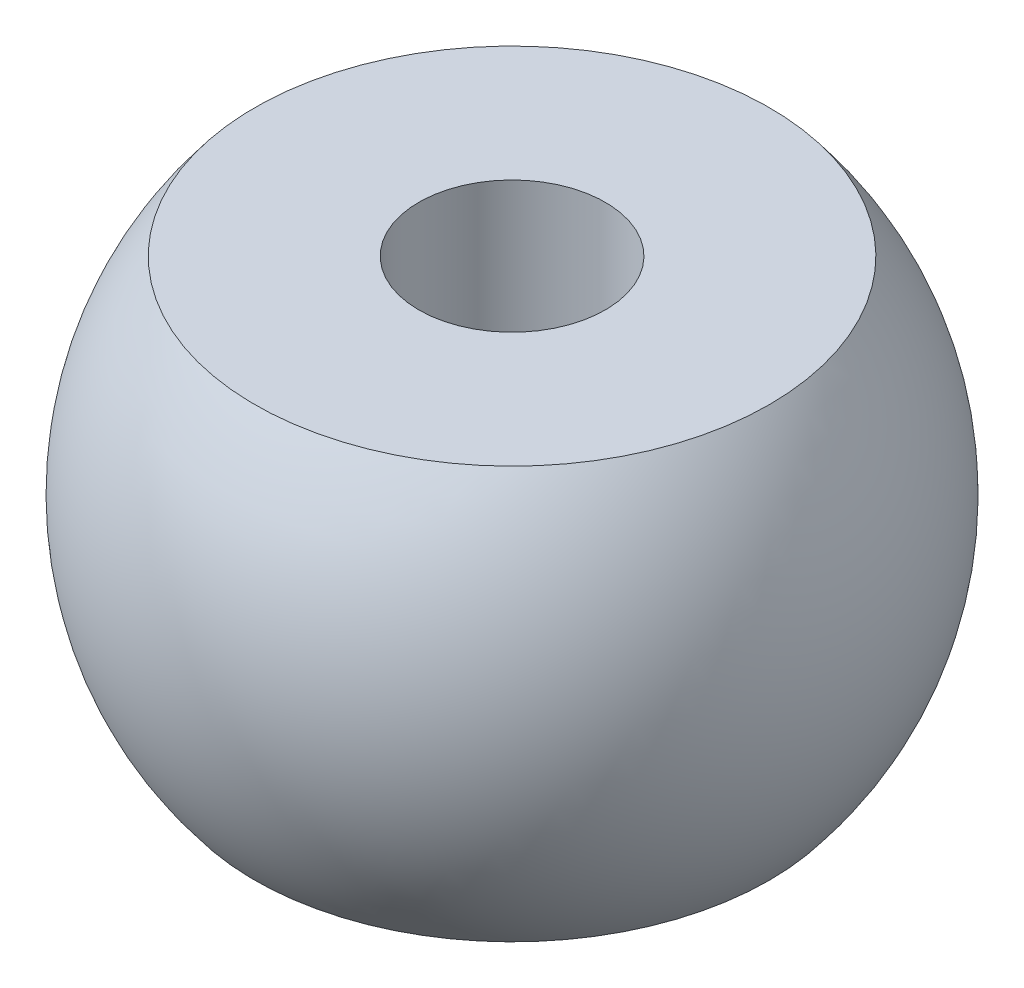
ISO-10303-21;
HEADER;
FILE_DESCRIPTION(('STEP AP214'),'2;1');
FILE_NAME('part.step','',(''),(''),'','','');
FILE_SCHEMA(('AUTOMOTIVE_DESIGN { 1 0 10303 214 1 1 1 1 }'));
ENDSEC;
DATA;
#1=APPLICATION_CONTEXT('core data for automotive mechanical design processes');
#2=APPLICATION_PROTOCOL_DEFINITION('international standard','automotive_design',2000,#1);
#3=PRODUCT_CONTEXT('',#1,'mechanical');
#4=PRODUCT('Part','Part','',(#3));
#5=PRODUCT_RELATED_PRODUCT_CATEGORY('part','',(#4));
#6=PRODUCT_DEFINITION_FORMATION('','',#4);
#7=PRODUCT_DEFINITION_CONTEXT('part definition',#1,'design');
#8=PRODUCT_DEFINITION('design','',#6,#7);
#9=PRODUCT_DEFINITION_SHAPE('','',#8);
#10=(LENGTH_UNIT() NAMED_UNIT(*) SI_UNIT(.MILLI.,.METRE.));
#11=(NAMED_UNIT(*) PLANE_ANGLE_UNIT() SI_UNIT($,.RADIAN.));
#12=(NAMED_UNIT(*) SI_UNIT($,.STERADIAN.) SOLID_ANGLE_UNIT());
#13=UNCERTAINTY_MEASURE_WITH_UNIT(LENGTH_MEASURE(1.E-05),#10,'distance_accuracy_value','');
#14=(GEOMETRIC_REPRESENTATION_CONTEXT(3) GLOBAL_UNCERTAINTY_ASSIGNED_CONTEXT((#13)) GLOBAL_UNIT_ASSIGNED_CONTEXT((#10,
#11,#12)) REPRESENTATION_CONTEXT('',''));
#15=CARTESIAN_POINT('',(0.,0.,0.));
#16=DIRECTION('',(0.,0.,1.));
#17=DIRECTION('',(1.,0.,0.));
#18=AXIS2_PLACEMENT_3D('',#15,#16,#17);
#19=CARTESIAN_POINT('',(3.,-6.625,0.));
#20=DIRECTION('',(0.,1.,0.));
#21=DIRECTION('',(0.,0.,1.));
#22=AXIS2_PLACEMENT_3D('',#19,#20,#21);
#23=PLANE('',#22);
#24=CARTESIAN_POINT('',(0.,-6.62500000000001,0.));
#25=DIRECTION('',(0.,1.,0.));
#26=DIRECTION('',(0.,0.,1.));
#27=AXIS2_PLACEMENT_3D('',#24,#25,#26);
#28=CIRCLE('',#27,8.27462234787788);
#29=CARTESIAN_POINT('',(8.27462234787788,-6.62500000000001,0.));
#30=VERTEX_POINT('',#29);
#31=EDGE_CURVE('E10',#30,#30,#28,.T.);
#32=ORIENTED_EDGE('',*,*,#31,.F.);
#33=EDGE_LOOP('',(#32));
#34=FACE_BOUND('',#33,.T.);
#35=CARTESIAN_POINT('',(0.,-6.625,0.));
#36=DIRECTION('',(0.,1.,0.));
#37=DIRECTION('',(0.,0.,1.));
#38=AXIS2_PLACEMENT_3D('',#35,#36,#37);
#39=CIRCLE('',#38,3.);
#40=CARTESIAN_POINT('',(0.,-6.625,3.));
#41=VERTEX_POINT('',#40);
#42=EDGE_CURVE('E46',#41,#41,#39,.T.);
#43=ORIENTED_EDGE('',*,*,#42,.T.);
#44=EDGE_LOOP('',(#43));
#45=FACE_BOUND('',#44,.T.);
#46=ADVANCED_FACE('F32',(#34,#45),#23,.F.);
#47=CARTESIAN_POINT('',(0.,0.,0.));
#48=DIRECTION('',(0.,1.,0.));
#49=DIRECTION('',(1.,0.,0.));
#50=AXIS2_PLACEMENT_3D('',#47,#48,#49);
#51=SPHERICAL_SURFACE('',#50,10.6);
#52=CARTESIAN_POINT('',(0.,6.625,0.));
#53=DIRECTION('',(0.,1.,0.));
#54=DIRECTION('',(0.,0.,1.));
#55=AXIS2_PLACEMENT_3D('',#52,#53,#54);
#56=CIRCLE('',#55,8.27462234787788);
#57=CARTESIAN_POINT('',(8.27462234787788,6.625,0.));
#58=VERTEX_POINT('',#57);
#59=EDGE_CURVE('E38',#58,#58,#56,.T.);
#60=CARTESIAN_POINT('',(8.27462234787788,6.625,0.));
#61=CARTESIAN_POINT('',(8.36780618467368,6.50861664026527,0.));
#62=CARTESIAN_POINT('',(8.45853138331952,6.39026498283566,0.));
#63=CARTESIAN_POINT('',(8.63491011465458,6.14984098782253,0.));
#64=CARTESIAN_POINT('',(8.7205636473438,6.02776865023899,0.));
#65=CARTESIAN_POINT('',(8.88664465710891,5.78011921015382,0.));
#66=CARTESIAN_POINT('',(8.9670721341848,5.65454210765217,0.));
#67=CARTESIAN_POINT('',(9.12255836578817,5.40010706699141,0.));
#68=CARTESIAN_POINT('',(9.19761712031565,5.27124912883229,0.));
#69=CARTESIAN_POINT('',(9.34223214913767,5.01048171115528,0.));
#70=CARTESIAN_POINT('',(9.41178842343221,4.87857223163741,0.));
#71=CARTESIAN_POINT('',(9.54527470339223,4.61193658536463,0.));
#72=CARTESIAN_POINT('',(9.60920470905771,4.47721041860973,0.));
#73=CARTESIAN_POINT('',(9.73132463278886,4.20518123214942,0.));
#74=CARTESIAN_POINT('',(9.78951455085454,4.06787821244402,0.));
#75=CARTESIAN_POINT('',(9.9000507114742,3.79093975086938,0.));
#76=CARTESIAN_POINT('',(9.95239695402819,3.65130430900014,0.));
#77=CARTESIAN_POINT('',(10.0511525753681,3.36994958364531,0.));
#78=CARTESIAN_POINT('',(10.0975619541541,3.22823030015973,0.));
#79=CARTESIAN_POINT('',(10.184361229489,2.94296018246203,0.));
#80=CARTESIAN_POINT('',(10.224751126038,2.79940934824991,0.));
#81=CARTESIAN_POINT('',(10.2994395341611,2.51073168036646,0.));
#82=CARTESIAN_POINT('',(10.3337380457351,2.36560484669513,0.));
#83=CARTESIAN_POINT('',(10.3961826252075,2.07403353682514,0.));
#84=CARTESIAN_POINT('',(10.4243286931058,1.92758906062647,0.));
#85=CARTESIAN_POINT('',(10.4744182791794,1.63364316830766,0.));
#86=CARTESIAN_POINT('',(10.4963617973547,1.4861417521875,0.));
#87=CARTESIAN_POINT('',(10.5340072198097,1.19034456421489,0.));
#88=CARTESIAN_POINT('',(10.5497091240895,1.04204879236243,0.));
#89=CARTESIAN_POINT('',(10.5748433659924,0.744926891237265,0.));
#90=CARTESIAN_POINT('',(10.5842757036156,0.596100761964553,0.));
#91=CARTESIAN_POINT('',(10.5968540206194,0.298183088461226,0.));
#92=CARTESIAN_POINT('',(10.6,0.149091544230611,0.));
#93=CARTESIAN_POINT('',(10.6,-0.149091544230618,0.));
#94=CARTESIAN_POINT('',(10.5968540206194,-0.298183088461233,0.));
#95=CARTESIAN_POINT('',(10.5842757036156,-0.59610076196456,0.));
#96=CARTESIAN_POINT('',(10.5748433659924,-0.744926891237273,0.));
#97=CARTESIAN_POINT('',(10.5497091240895,-1.04204879236244,0.));
#98=CARTESIAN_POINT('',(10.5340072198097,-1.19034456421489,0.));
#99=CARTESIAN_POINT('',(10.4963617973547,-1.48614175218751,0.));
#100=CARTESIAN_POINT('',(10.4744182791794,-1.63364316830766,0.));
#101=CARTESIAN_POINT('',(10.4243286931058,-1.92758906062648,0.));
#102=CARTESIAN_POINT('',(10.3961826252075,-2.07403353682514,0.));
#103=CARTESIAN_POINT('',(10.3337380457351,-2.36560484669513,0.));
#104=CARTESIAN_POINT('',(10.2994395341611,-2.51073168036646,0.));
#105=CARTESIAN_POINT('',(10.224751126038,-2.79940934824991,0.));
#106=CARTESIAN_POINT('',(10.184361229489,-2.94296018246203,0.));
#107=CARTESIAN_POINT('',(10.0975619541541,-3.22823030015974,0.));
#108=CARTESIAN_POINT('',(10.0511525753681,-3.36994958364532,0.));
#109=CARTESIAN_POINT('',(9.95239695402818,-3.65130430900015,0.));
#110=CARTESIAN_POINT('',(9.9000507114742,-3.79093975086939,0.));
#111=CARTESIAN_POINT('',(9.78951455085454,-4.06787821244403,0.));
#112=CARTESIAN_POINT('',(9.73132463278886,-4.20518123214943,0.));
#113=CARTESIAN_POINT('',(9.6092047090577,-4.47721041860973,0.));
#114=CARTESIAN_POINT('',(9.54527470339223,-4.61193658536463,0.));
#115=CARTESIAN_POINT('',(9.41178842343221,-4.87857223163741,0.));
#116=CARTESIAN_POINT('',(9.34223214913766,-5.01048171115529,0.));
#117=CARTESIAN_POINT('',(9.19761712031564,-5.27124912883229,0.));
#118=CARTESIAN_POINT('',(9.12255836578816,-5.40010706699141,0.));
#119=CARTESIAN_POINT('',(8.96707213418479,-5.65454210765218,0.));
#120=CARTESIAN_POINT('',(8.8866446571089,-5.78011921015382,0.));
#121=CARTESIAN_POINT('',(8.72056364734379,-6.027768650239,0.));
#122=CARTESIAN_POINT('',(8.63491011465458,-6.14984098782253,0.));
#123=CARTESIAN_POINT('',(8.45853138331952,-6.39026498283567,0.));
#124=CARTESIAN_POINT('',(8.36780618467368,-6.50861664026527,0.));
#125=CARTESIAN_POINT('',(8.27462234787788,-6.62500000000001,0.));
#126=B_SPLINE_CURVE_WITH_KNOTS('',3,(#60,#61,#62,#63,#64,#65,#66,#67,#68,#69,#70,#71,#72,#73,
#74,#75,#76,#77,#78,#79,#80,#81,#82,#83,#84,#85,#86,#87,#88,#89,#90,#91,#92,#93,#94,#95,#96,#97,
#98,#99,#100,#101,#102,#103,#104,#105,#106,#107,#108,#109,#110,#111,#112,#113,#114,#115,#116,
#117,#118,#119,#120,#121,#122,#123,#124,#125),.UNSPECIFIED.,.F.,.F.,(4,2,2,2,2,2,2,2,2,2,2,2,2,
2,2,2,2,2,2,2,2,2,2,2,2,2,2,2,2,2,2,2,4),(0.,0.447241459515948,0.894482919031895,
1.34172437854784,1.78896583806379,2.23620729757974,2.68344875709569,3.13069021661164,
3.57793167612758,4.02517313564353,4.47241459515948,4.91965605467543,5.36689751419137,
5.81413897370732,6.26138043322327,6.70862189273922,7.15586335225517,7.60310481177112,
8.05034627128706,8.49758773080301,8.94482919031896,9.3920706498349,9.83931210935085,
10.2865535688668,10.7337950283828,11.1810364878987,11.6282779474146,12.0755194069306,
12.5227608664465,12.9700023259625,13.4172437854784,13.8644852449944,14.3117267045103),.UNSPECIFIED.);
#127=EDGE_CURVE('BSEAM61',#58,#30,#126,.T.);
#128=ORIENTED_EDGE('',*,*,#59,.F.);
#129=ORIENTED_EDGE('',*,*,#31,.T.);
#130=ORIENTED_EDGE('',*,*,#127,.T.);
#131=ORIENTED_EDGE('',*,*,#127,.F.);
#132=EDGE_LOOP('',(#128,#130,#129,#131));
#133=FACE_BOUND('',#132,.T.);
#134=ADVANCED_FACE('F61',(#133),#51,.T.);
#135=CARTESIAN_POINT('',(3.,6.625,0.));
#136=DIRECTION('',(0.,-1.,0.));
#137=DIRECTION('',(0.,0.,-1.));
#138=AXIS2_PLACEMENT_3D('',#135,#136,#137);
#139=PLANE('',#138);
#140=CARTESIAN_POINT('',(0.,6.625,0.));
#141=DIRECTION('',(0.,1.,0.));
#142=DIRECTION('',(0.,0.,1.));
#143=AXIS2_PLACEMENT_3D('',#140,#141,#142);
#144=CIRCLE('',#143,3.);
#145=CARTESIAN_POINT('',(0.,6.625,3.));
#146=VERTEX_POINT('',#145);
#147=EDGE_CURVE('E42',#146,#146,#144,.T.);
#148=ORIENTED_EDGE('',*,*,#147,.F.);
#149=EDGE_LOOP('',(#148));
#150=FACE_BOUND('',#149,.T.);
#151=ORIENTED_EDGE('',*,*,#59,.T.);
#152=EDGE_LOOP('',(#151));
#153=FACE_BOUND('',#152,.T.);
#154=ADVANCED_FACE('F56',(#150,#153),#139,.F.);
#155=CARTESIAN_POINT('',(0.,6.625,0.));
#156=DIRECTION('',(0.,1.,0.));
#157=DIRECTION('',(0.,0.,1.));
#158=AXIS2_PLACEMENT_3D('',#155,#156,#157);
#159=CYLINDRICAL_SURFACE('',#158,3.);
#160=ORIENTED_EDGE('',*,*,#42,.F.);
#161=EDGE_LOOP('',(#160));
#162=FACE_BOUND('',#161,.T.);
#163=ORIENTED_EDGE('',*,*,#147,.T.);
#164=EDGE_LOOP('',(#163));
#165=FACE_BOUND('',#164,.T.);
#166=ADVANCED_FACE('F53',(#162,#165),#159,.F.);
#167=CLOSED_SHELL('',(#46,#134,#154,#166));
#168=MANIFOLD_SOLID_BREP('B2',#167);
#169=ADVANCED_BREP_SHAPE_REPRESENTATION('',(#18,#168),#14);
#170=SHAPE_DEFINITION_REPRESENTATION(#9,#169);
ENDSEC;
END-ISO-10303-21;
